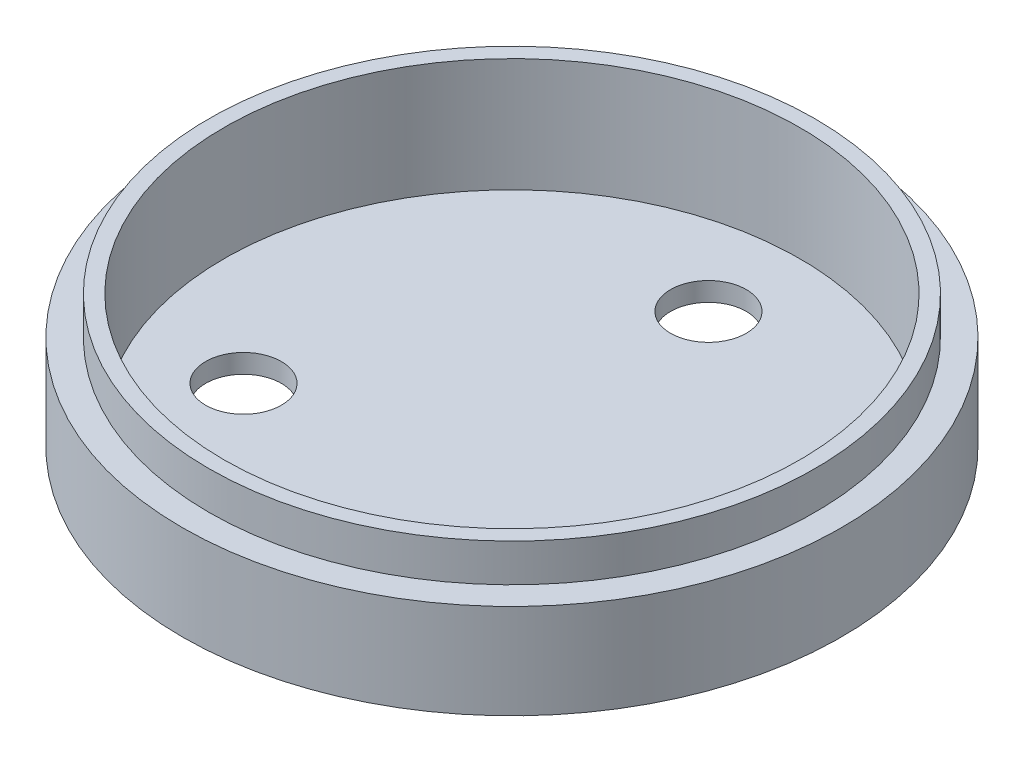
ISO-10303-21;
HEADER;
FILE_DESCRIPTION(('STEP AP214'),'2;1');
FILE_NAME('part.step','',(''),(''),'','','');
FILE_SCHEMA(('AUTOMOTIVE_DESIGN { 1 0 10303 214 1 1 1 1 }'));
ENDSEC;
DATA;
#1=APPLICATION_CONTEXT('core data for automotive mechanical design processes');
#2=APPLICATION_PROTOCOL_DEFINITION('international standard','automotive_design',2000,#1);
#3=PRODUCT_CONTEXT('',#1,'mechanical');
#4=PRODUCT('Part','Part','',(#3));
#5=PRODUCT_RELATED_PRODUCT_CATEGORY('part','',(#4));
#6=PRODUCT_DEFINITION_FORMATION('','',#4);
#7=PRODUCT_DEFINITION_CONTEXT('part definition',#1,'design');
#8=PRODUCT_DEFINITION('design','',#6,#7);
#9=PRODUCT_DEFINITION_SHAPE('','',#8);
#10=(LENGTH_UNIT() NAMED_UNIT(*) SI_UNIT(.MILLI.,.METRE.));
#11=(NAMED_UNIT(*) PLANE_ANGLE_UNIT() SI_UNIT($,.RADIAN.));
#12=(NAMED_UNIT(*) SI_UNIT($,.STERADIAN.) SOLID_ANGLE_UNIT());
#13=UNCERTAINTY_MEASURE_WITH_UNIT(LENGTH_MEASURE(1.E-05),#10,'distance_accuracy_value','');
#14=(GEOMETRIC_REPRESENTATION_CONTEXT(3) GLOBAL_UNCERTAINTY_ASSIGNED_CONTEXT((#13)) GLOBAL_UNIT_ASSIGNED_CONTEXT((#10,
#11,#12)) REPRESENTATION_CONTEXT('',''));
#15=CARTESIAN_POINT('',(0.,0.,0.));
#16=DIRECTION('',(0.,0.,1.));
#17=DIRECTION('',(1.,0.,0.));
#18=AXIS2_PLACEMENT_3D('',#15,#16,#17);
#19=CARTESIAN_POINT('',(0.,5.,0.));
#20=DIRECTION('',(0.,1.,0.));
#21=DIRECTION('',(0.,0.,1.));
#22=AXIS2_PLACEMENT_3D('',#19,#20,#21);
#23=PLANE('',#22);
#24=CARTESIAN_POINT('',(-44.9235678213145,5.,25.9383660254057));
#25=DIRECTION('',(0.,1.,0.));
#26=DIRECTION('',(0.,0.,1.));
#27=AXIS2_PLACEMENT_3D('',#24,#25,#26);
#28=CIRCLE('',#27,9.99999999999999);
#29=CARTESIAN_POINT('',(-44.9235678213145,5.,35.9383660254057));
#30=VERTEX_POINT('',#29);
#31=EDGE_CURVE('E62',#30,#30,#28,.T.);
#32=ORIENTED_EDGE('',*,*,#31,.F.);
#33=EDGE_LOOP('',(#32));
#34=FACE_BOUND('',#33,.T.);
#35=CARTESIAN_POINT('',(0.,5.,-51.875));
#36=DIRECTION('',(0.,1.,0.));
#37=DIRECTION('',(0.,0.,1.));
#38=AXIS2_PLACEMENT_3D('',#35,#36,#37);
#39=CIRCLE('',#38,10.);
#40=CARTESIAN_POINT('',(0.,5.,-41.875));
#41=VERTEX_POINT('',#40);
#42=EDGE_CURVE('E49',#41,#41,#39,.T.);
#43=ORIENTED_EDGE('',*,*,#42,.F.);
#44=EDGE_LOOP('',(#43));
#45=FACE_BOUND('',#44,.T.);
#46=CARTESIAN_POINT('',(44.9265678213211,5.,25.9366339745943));
#47=DIRECTION('',(0.,1.,0.));
#48=DIRECTION('',(0.,0.,1.));
#49=AXIS2_PLACEMENT_3D('',#46,#47,#48);
#50=CIRCLE('',#49,10.);
#51=CARTESIAN_POINT('',(44.9265678213211,5.,35.9366339745943));
#52=VERTEX_POINT('',#51);
#53=EDGE_CURVE('E57',#52,#52,#50,.T.);
#54=ORIENTED_EDGE('',*,*,#53,.F.);
#55=EDGE_LOOP('',(#54));
#56=FACE_BOUND('',#55,.T.);
#57=CARTESIAN_POINT('',(0.,5.,0.));
#58=DIRECTION('',(0.,1.,0.));
#59=DIRECTION('',(0.,0.,1.));
#60=AXIS2_PLACEMENT_3D('',#57,#58,#59);
#61=CIRCLE('',#60,76.);
#62=CARTESIAN_POINT('',(0.,5.,76.));
#63=VERTEX_POINT('',#62);
#64=EDGE_CURVE('E10',#63,#63,#61,.F.);
#65=ORIENTED_EDGE('',*,*,#64,.F.);
#66=EDGE_LOOP('',(#65));
#67=FACE_BOUND('',#66,.T.);
#68=ADVANCED_FACE('F38',(#34,#45,#56,#67),#23,.T.);
#69=CARTESIAN_POINT('',(0.,0.,0.));
#70=DIRECTION('',(0.,1.,0.));
#71=DIRECTION('',(0.,0.,1.));
#72=AXIS2_PLACEMENT_3D('',#69,#70,#71);
#73=PLANE('',#72);
#74=CARTESIAN_POINT('',(0.,0.,0.));
#75=DIRECTION('',(0.,1.,0.));
#76=DIRECTION('',(0.,0.,1.));
#77=AXIS2_PLACEMENT_3D('',#74,#75,#76);
#78=CIRCLE('',#77,87.);
#79=CARTESIAN_POINT('',(0.,0.,87.));
#80=VERTEX_POINT('',#79);
#81=EDGE_CURVE('E45',#80,#80,#78,.T.);
#82=ORIENTED_EDGE('',*,*,#81,.F.);
#83=EDGE_LOOP('',(#82));
#84=FACE_BOUND('',#83,.T.);
#85=CARTESIAN_POINT('',(0.,0.,-51.875));
#86=DIRECTION('',(0.,1.,0.));
#87=DIRECTION('',(0.,0.,1.));
#88=AXIS2_PLACEMENT_3D('',#85,#86,#87);
#89=CIRCLE('',#88,10.);
#90=CARTESIAN_POINT('',(0.,0.,-41.875));
#91=VERTEX_POINT('',#90);
#92=EDGE_CURVE('E53',#91,#91,#89,.T.);
#93=ORIENTED_EDGE('',*,*,#92,.T.);
#94=EDGE_LOOP('',(#93));
#95=FACE_BOUND('',#94,.T.);
#96=CARTESIAN_POINT('',(44.9265678213211,0.,25.9366339745943));
#97=DIRECTION('',(0.,1.,0.));
#98=DIRECTION('',(0.,0.,1.));
#99=AXIS2_PLACEMENT_3D('',#96,#97,#98);
#100=CIRCLE('',#99,10.);
#101=CARTESIAN_POINT('',(44.9265678213211,0.,35.9366339745943));
#102=VERTEX_POINT('',#101);
#103=EDGE_CURVE('E59',#102,#102,#100,.T.);
#104=ORIENTED_EDGE('',*,*,#103,.T.);
#105=EDGE_LOOP('',(#104));
#106=FACE_BOUND('',#105,.T.);
#107=CARTESIAN_POINT('',(-44.9235678213145,0.,25.9383660254057));
#108=DIRECTION('',(0.,1.,0.));
#109=DIRECTION('',(0.,0.,1.));
#110=AXIS2_PLACEMENT_3D('',#107,#108,#109);
#111=CIRCLE('',#110,9.99999999999999);
#112=CARTESIAN_POINT('',(-44.9235678213145,0.,35.9383660254057));
#113=VERTEX_POINT('',#112);
#114=EDGE_CURVE('E65',#113,#113,#111,.T.);
#115=ORIENTED_EDGE('',*,*,#114,.T.);
#116=EDGE_LOOP('',(#115));
#117=FACE_BOUND('',#116,.T.);
#118=ADVANCED_FACE('F97',(#84,#95,#106,#117),#73,.F.);
#119=CARTESIAN_POINT('',(0.,5.,0.));
#120=DIRECTION('',(0.,-1.,0.));
#121=DIRECTION('',(0.,0.,-1.));
#122=AXIS2_PLACEMENT_3D('',#119,#120,#121);
#123=CYLINDRICAL_SURFACE('',#122,87.);
#124=ORIENTED_EDGE('',*,*,#81,.T.);
#125=EDGE_LOOP('',(#124));
#126=FACE_BOUND('',#125,.T.);
#127=CARTESIAN_POINT('',(0.,25.,0.));
#128=DIRECTION('',(0.,1.,0.));
#129=DIRECTION('',(0.,0.,1.));
#130=AXIS2_PLACEMENT_3D('',#127,#128,#129);
#131=CIRCLE('',#130,87.);
#132=CARTESIAN_POINT('',(0.,25.,87.));
#133=VERTEX_POINT('',#132);
#134=EDGE_CURVE('E76',#133,#133,#131,.T.);
#135=ORIENTED_EDGE('',*,*,#134,.F.);
#136=EDGE_LOOP('',(#135));
#137=FACE_BOUND('',#136,.T.);
#138=ADVANCED_FACE('F40',(#126,#137),#123,.T.);
#139=CARTESIAN_POINT('',(0.,5.,-51.875));
#140=DIRECTION('',(0.,-1.,0.));
#141=DIRECTION('',(0.,0.,-1.));
#142=AXIS2_PLACEMENT_3D('',#139,#140,#141);
#143=CYLINDRICAL_SURFACE('',#142,10.);
#144=ORIENTED_EDGE('',*,*,#42,.T.);
#145=EDGE_LOOP('',(#144));
#146=FACE_BOUND('',#145,.T.);
#147=ORIENTED_EDGE('',*,*,#92,.F.);
#148=EDGE_LOOP('',(#147));
#149=FACE_BOUND('',#148,.T.);
#150=ADVANCED_FACE('F107',(#146,#149),#143,.F.);
#151=CARTESIAN_POINT('',(44.9265678213211,5.,25.9366339745943));
#152=DIRECTION('',(0.,-1.,0.));
#153=DIRECTION('',(0.,0.,-1.));
#154=AXIS2_PLACEMENT_3D('',#151,#152,#153);
#155=CYLINDRICAL_SURFACE('',#154,10.);
#156=ORIENTED_EDGE('',*,*,#53,.T.);
#157=EDGE_LOOP('',(#156));
#158=FACE_BOUND('',#157,.T.);
#159=ORIENTED_EDGE('',*,*,#103,.F.);
#160=EDGE_LOOP('',(#159));
#161=FACE_BOUND('',#160,.T.);
#162=ADVANCED_FACE('F110',(#158,#161),#155,.F.);
#163=CARTESIAN_POINT('',(-44.9235678213145,5.,25.9383660254057));
#164=DIRECTION('',(0.,-1.,0.));
#165=DIRECTION('',(0.,0.,-1.));
#166=AXIS2_PLACEMENT_3D('',#163,#164,#165);
#167=CYLINDRICAL_SURFACE('',#166,9.99999999999999);
#168=ORIENTED_EDGE('',*,*,#31,.T.);
#169=EDGE_LOOP('',(#168));
#170=FACE_BOUND('',#169,.T.);
#171=ORIENTED_EDGE('',*,*,#114,.F.);
#172=EDGE_LOOP('',(#171));
#173=FACE_BOUND('',#172,.T.);
#174=ADVANCED_FACE('F114',(#170,#173),#167,.F.);
#175=CARTESIAN_POINT('',(0.,35.,0.));
#176=DIRECTION('',(0.,1.,0.));
#177=DIRECTION('',(0.,0.,1.));
#178=AXIS2_PLACEMENT_3D('',#175,#176,#177);
#179=PLANE('',#178);
#180=CARTESIAN_POINT('',(0.,35.,0.));
#181=DIRECTION('',(0.,1.,0.));
#182=DIRECTION('',(0.,0.,1.));
#183=AXIS2_PLACEMENT_3D('',#180,#181,#182);
#184=CIRCLE('',#183,80.);
#185=CARTESIAN_POINT('',(0.,35.,80.));
#186=VERTEX_POINT('',#185);
#187=EDGE_CURVE('E68',#186,#186,#184,.T.);
#188=ORIENTED_EDGE('',*,*,#187,.T.);
#189=EDGE_LOOP('',(#188));
#190=FACE_BOUND('',#189,.T.);
#191=CARTESIAN_POINT('',(0.,35.,0.));
#192=DIRECTION('',(0.,1.,0.));
#193=DIRECTION('',(0.,0.,1.));
#194=AXIS2_PLACEMENT_3D('',#191,#192,#193);
#195=CIRCLE('',#194,76.);
#196=CARTESIAN_POINT('',(0.,35.,76.));
#197=VERTEX_POINT('',#196);
#198=EDGE_CURVE('E73',#197,#197,#195,.T.);
#199=ORIENTED_EDGE('',*,*,#198,.F.);
#200=EDGE_LOOP('',(#199));
#201=FACE_BOUND('',#200,.T.);
#202=ADVANCED_FACE('F118',(#190,#201),#179,.T.);
#203=CARTESIAN_POINT('',(0.,35.,0.));
#204=DIRECTION('',(0.,-1.,0.));
#205=DIRECTION('',(0.,0.,-1.));
#206=AXIS2_PLACEMENT_3D('',#203,#204,#205);
#207=CYLINDRICAL_SURFACE('',#206,80.);
#208=CARTESIAN_POINT('',(0.,25.,0.));
#209=DIRECTION('',(0.,1.,0.));
#210=DIRECTION('',(0.,0.,1.));
#211=AXIS2_PLACEMENT_3D('',#208,#209,#210);
#212=CIRCLE('',#211,80.);
#213=CARTESIAN_POINT('',(0.,25.,80.));
#214=VERTEX_POINT('',#213);
#215=EDGE_CURVE('E79',#214,#214,#212,.T.);
#216=ORIENTED_EDGE('',*,*,#215,.T.);
#217=EDGE_LOOP('',(#216));
#218=FACE_BOUND('',#217,.T.);
#219=ORIENTED_EDGE('',*,*,#187,.F.);
#220=EDGE_LOOP('',(#219));
#221=FACE_BOUND('',#220,.T.);
#222=ADVANCED_FACE('F83',(#218,#221),#207,.T.);
#223=CARTESIAN_POINT('',(0.,35.,0.));
#224=DIRECTION('',(0.,-1.,0.));
#225=DIRECTION('',(0.,0.,-1.));
#226=AXIS2_PLACEMENT_3D('',#223,#224,#225);
#227=CYLINDRICAL_SURFACE('',#226,76.);
#228=ORIENTED_EDGE('',*,*,#198,.T.);
#229=EDGE_LOOP('',(#228));
#230=FACE_BOUND('',#229,.T.);
#231=ORIENTED_EDGE('',*,*,#64,.T.);
#232=EDGE_LOOP('',(#231));
#233=FACE_BOUND('',#232,.T.);
#234=ADVANCED_FACE('F88',(#230,#233),#227,.F.);
#235=CARTESIAN_POINT('',(0.,25.,0.));
#236=DIRECTION('',(0.,1.,0.));
#237=DIRECTION('',(0.,0.,1.));
#238=AXIS2_PLACEMENT_3D('',#235,#236,#237);
#239=PLANE('',#238);
#240=ORIENTED_EDGE('',*,*,#134,.T.);
#241=EDGE_LOOP('',(#240));
#242=FACE_BOUND('',#241,.T.);
#243=ORIENTED_EDGE('',*,*,#215,.F.);
#244=EDGE_LOOP('',(#243));
#245=FACE_BOUND('',#244,.T.);
#246=ADVANCED_FACE('F86',(#242,#245),#239,.T.);
#247=CLOSED_SHELL('',(#68,#118,#138,#150,#162,#174,#202,#222,#234,#246));
#248=MANIFOLD_SOLID_BREP('B2',#247);
#249=ADVANCED_BREP_SHAPE_REPRESENTATION('',(#18,#248),#14);
#250=SHAPE_DEFINITION_REPRESENTATION(#9,#249);
ENDSEC;
END-ISO-10303-21;
